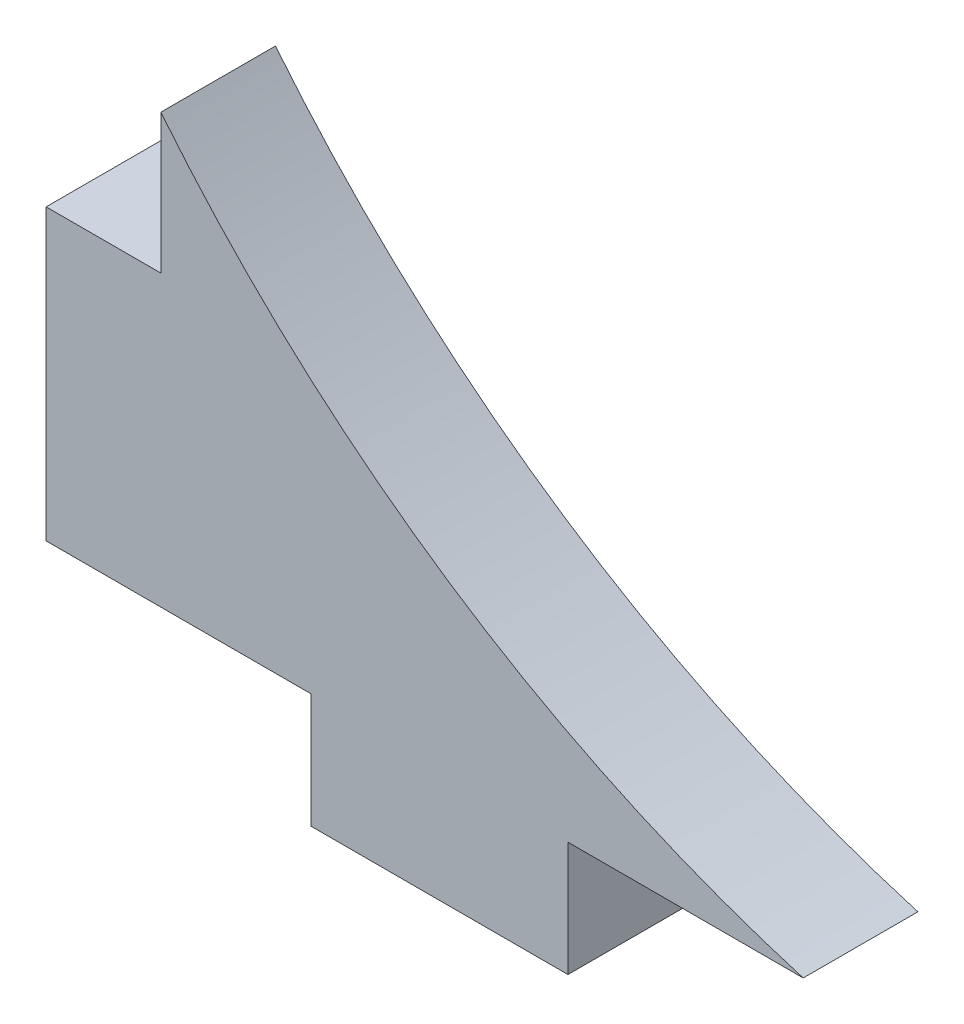
ISO-10303-21;
HEADER;
FILE_DESCRIPTION(('STEP AP214'),'2;1');
FILE_NAME('part.step','',(''),(''),'','','');
FILE_SCHEMA(('AUTOMOTIVE_DESIGN { 1 0 10303 214 1 1 1 1 }'));
ENDSEC;
DATA;
#1=APPLICATION_CONTEXT('core data for automotive mechanical design processes');
#2=APPLICATION_PROTOCOL_DEFINITION('international standard','automotive_design',2000,#1);
#3=PRODUCT_CONTEXT('',#1,'mechanical');
#4=PRODUCT('Part','Part','',(#3));
#5=PRODUCT_RELATED_PRODUCT_CATEGORY('part','',(#4));
#6=PRODUCT_DEFINITION_FORMATION('','',#4);
#7=PRODUCT_DEFINITION_CONTEXT('part definition',#1,'design');
#8=PRODUCT_DEFINITION('design','',#6,#7);
#9=PRODUCT_DEFINITION_SHAPE('','',#8);
#10=(LENGTH_UNIT() NAMED_UNIT(*) SI_UNIT(.MILLI.,.METRE.));
#11=(NAMED_UNIT(*) PLANE_ANGLE_UNIT() SI_UNIT($,.RADIAN.));
#12=(NAMED_UNIT(*) SI_UNIT($,.STERADIAN.) SOLID_ANGLE_UNIT());
#13=UNCERTAINTY_MEASURE_WITH_UNIT(LENGTH_MEASURE(1.E-05),#10,'distance_accuracy_value','');
#14=(GEOMETRIC_REPRESENTATION_CONTEXT(3) GLOBAL_UNCERTAINTY_ASSIGNED_CONTEXT((#13)) GLOBAL_UNIT_ASSIGNED_CONTEXT((#10,
#11,#12)) REPRESENTATION_CONTEXT('',''));
#15=CARTESIAN_POINT('',(0.,0.,0.));
#16=DIRECTION('',(0.,0.,1.));
#17=DIRECTION('',(1.,0.,0.));
#18=AXIS2_PLACEMENT_3D('',#15,#16,#17);
#19=CARTESIAN_POINT('',(52.4119370480957,63.4241694361046,5.35));
#20=DIRECTION('',(0.,0.,-1.));
#21=DIRECTION('',(-1.,0.,0.));
#22=AXIS2_PLACEMENT_3D('',#19,#20,#21);
#23=CYLINDRICAL_SURFACE('',#22,60.5348517727187);
#24=CARTESIAN_POINT('',(52.4119370480957,63.4241694361046,0.));
#25=DIRECTION('',(0.,0.,-1.));
#26=DIRECTION('',(1.,0.,0.));
#27=AXIS2_PLACEMENT_3D('',#24,#25,#26);
#28=CIRCLE('',#27,60.5348517727187);
#29=CARTESIAN_POINT('',(35.3280517737975,5.35000010860032,0.));
#30=VERTEX_POINT('',#29);
#31=CARTESIAN_POINT('',(5.34999999219954,25.3500002436995,0.));
#32=VERTEX_POINT('',#31);
#33=EDGE_CURVE('E135',#30,#32,#28,.T.);
#34=ORIENTED_EDGE('',*,*,#33,.T.);
#35=DIRECTION('',(0.,0.,-1.));
#36=VECTOR('',#35,1.);
#37=CARTESIAN_POINT('',(5.34999999219954,25.3500002436995,5.35));
#38=LINE('',#37,#36);
#39=CARTESIAN_POINT('',(5.34999999219954,25.3500002436995,5.35));
#40=VERTEX_POINT('',#39);
#41=EDGE_CURVE('E11',#40,#32,#38,.T.);
#42=ORIENTED_EDGE('',*,*,#41,.F.);
#43=CARTESIAN_POINT('',(52.4119370480957,63.4241694361046,5.35));
#44=DIRECTION('',(0.,0.,-1.));
#45=DIRECTION('',(1.,0.,0.));
#46=AXIS2_PLACEMENT_3D('',#43,#44,#45);
#47=CIRCLE('',#46,60.5348517727187);
#48=CARTESIAN_POINT('',(35.3280517737975,5.35000010860032,5.35));
#49=VERTEX_POINT('',#48);
#50=EDGE_CURVE('E151',#49,#40,#47,.T.);
#51=ORIENTED_EDGE('',*,*,#50,.F.);
#52=DIRECTION('',(0.,0.,-1.));
#53=VECTOR('',#52,1.);
#54=CARTESIAN_POINT('',(35.3280517737975,5.35000010860032,5.35));
#55=LINE('',#54,#53);
#56=EDGE_CURVE('E131',#49,#30,#55,.T.);
#57=ORIENTED_EDGE('',*,*,#56,.T.);
#58=EDGE_LOOP('',(#34,#42,#51,#57));
#59=FACE_BOUND('',#58,.T.);
#60=ADVANCED_FACE('F33',(#59),#23,.F.);
#61=CARTESIAN_POINT('',(5.34999999219954,18.8500001094994,5.35));
#62=DIRECTION('',(1.,0.,0.));
#63=DIRECTION('',(0.,0.,-1.));
#64=AXIS2_PLACEMENT_3D('',#61,#62,#63);
#65=PLANE('',#64);
#66=DIRECTION('',(0.,-1.,0.));
#67=VECTOR('',#66,1.);
#68=CARTESIAN_POINT('',(5.34999999219954,18.8500001094994,0.));
#69=LINE('',#68,#67);
#70=CARTESIAN_POINT('',(5.34999999219954,18.8500001094994,0.));
#71=VERTEX_POINT('',#70);
#72=EDGE_CURVE('E138',#32,#71,#69,.T.);
#73=ORIENTED_EDGE('',*,*,#72,.T.);
#74=DIRECTION('',(0.,0.,-1.));
#75=VECTOR('',#74,1.);
#76=CARTESIAN_POINT('',(5.34999999219954,18.8500001094994,5.35));
#77=LINE('',#76,#75);
#78=CARTESIAN_POINT('',(5.34999999219954,18.8500001094994,5.35));
#79=VERTEX_POINT('',#78);
#80=EDGE_CURVE('E41',#79,#71,#77,.T.);
#81=ORIENTED_EDGE('',*,*,#80,.F.);
#82=DIRECTION('',(0.,-1.,0.));
#83=VECTOR('',#82,1.);
#84=CARTESIAN_POINT('',(5.34999999219954,18.8500001094994,5.35));
#85=LINE('',#84,#83);
#86=EDGE_CURVE('E95',#40,#79,#85,.T.);
#87=ORIENTED_EDGE('',*,*,#86,.F.);
#88=ORIENTED_EDGE('',*,*,#41,.T.);
#89=EDGE_LOOP('',(#73,#81,#87,#88));
#90=FACE_BOUND('',#89,.T.);
#91=ADVANCED_FACE('F194',(#90),#65,.F.);
#92=CARTESIAN_POINT('',(0.,18.8500001094994,5.35));
#93=DIRECTION('',(0.,-1.,0.));
#94=DIRECTION('',(0.,0.,-1.));
#95=AXIS2_PLACEMENT_3D('',#92,#93,#94);
#96=PLANE('',#95);
#97=DIRECTION('',(-1.,0.,0.));
#98=VECTOR('',#97,1.);
#99=CARTESIAN_POINT('',(0.,18.8500001094994,0.));
#100=LINE('',#99,#98);
#101=CARTESIAN_POINT('',(0.,18.8500001094994,0.));
#102=VERTEX_POINT('',#101);
#103=EDGE_CURVE('E140',#71,#102,#100,.T.);
#104=ORIENTED_EDGE('',*,*,#103,.T.);
#105=DIRECTION('',(0.,0.,-1.));
#106=VECTOR('',#105,1.);
#107=CARTESIAN_POINT('',(0.,18.8500001094994,5.35));
#108=LINE('',#107,#106);
#109=CARTESIAN_POINT('',(0.,18.8500001094994,5.35));
#110=VERTEX_POINT('',#109);
#111=EDGE_CURVE('E161',#110,#102,#108,.T.);
#112=ORIENTED_EDGE('',*,*,#111,.F.);
#113=DIRECTION('',(-1.,0.,0.));
#114=VECTOR('',#113,1.);
#115=CARTESIAN_POINT('',(0.,18.8500001094994,5.35));
#116=LINE('',#115,#114);
#117=EDGE_CURVE('E169',#79,#110,#116,.T.);
#118=ORIENTED_EDGE('',*,*,#117,.F.);
#119=ORIENTED_EDGE('',*,*,#80,.T.);
#120=EDGE_LOOP('',(#104,#112,#118,#119));
#121=FACE_BOUND('',#120,.T.);
#122=ADVANCED_FACE('F167',(#121),#96,.F.);
#123=CARTESIAN_POINT('',(0.,5.35000010859937,5.35));
#124=DIRECTION('',(1.,0.,0.));
#125=DIRECTION('',(0.,0.,-1.));
#126=AXIS2_PLACEMENT_3D('',#123,#124,#125);
#127=PLANE('',#126);
#128=DIRECTION('',(0.,-1.,0.));
#129=VECTOR('',#128,1.);
#130=CARTESIAN_POINT('',(0.,5.35000010859937,0.));
#131=LINE('',#130,#129);
#132=CARTESIAN_POINT('',(0.,5.35000010859937,0.));
#133=VERTEX_POINT('',#132);
#134=EDGE_CURVE('E142',#102,#133,#131,.T.);
#135=ORIENTED_EDGE('',*,*,#134,.T.);
#136=DIRECTION('',(0.,0.,-1.));
#137=VECTOR('',#136,1.);
#138=CARTESIAN_POINT('',(0.,5.35000010859937,5.35));
#139=LINE('',#138,#137);
#140=CARTESIAN_POINT('',(0.,5.35000010859937,5.35));
#141=VERTEX_POINT('',#140);
#142=EDGE_CURVE('E158',#141,#133,#139,.T.);
#143=ORIENTED_EDGE('',*,*,#142,.F.);
#144=DIRECTION('',(0.,-1.,0.));
#145=VECTOR('',#144,1.);
#146=CARTESIAN_POINT('',(0.,5.35000010859937,5.35));
#147=LINE('',#146,#145);
#148=EDGE_CURVE('E185',#110,#141,#147,.T.);
#149=ORIENTED_EDGE('',*,*,#148,.F.);
#150=ORIENTED_EDGE('',*,*,#111,.T.);
#151=EDGE_LOOP('',(#135,#143,#149,#150));
#152=FACE_BOUND('',#151,.T.);
#153=ADVANCED_FACE('F178',(#152),#127,.F.);
#154=CARTESIAN_POINT('',(12.3500002082998,5.35000010859937,5.35));
#155=DIRECTION('',(0.,1.,0.));
#156=DIRECTION('',(0.,0.,1.));
#157=AXIS2_PLACEMENT_3D('',#154,#155,#156);
#158=PLANE('',#157);
#159=DIRECTION('',(1.,0.,0.));
#160=VECTOR('',#159,1.);
#161=CARTESIAN_POINT('',(12.3500002082998,5.35000010859937,0.));
#162=LINE('',#161,#160);
#163=CARTESIAN_POINT('',(12.3500002082998,5.35000010859937,0.));
#164=VERTEX_POINT('',#163);
#165=EDGE_CURVE('E144',#133,#164,#162,.T.);
#166=ORIENTED_EDGE('',*,*,#165,.T.);
#167=DIRECTION('',(0.,0.,-1.));
#168=VECTOR('',#167,1.);
#169=CARTESIAN_POINT('',(12.3500002082998,5.35000010859937,5.35));
#170=LINE('',#169,#168);
#171=CARTESIAN_POINT('',(12.3500002082998,5.35000010859937,5.35));
#172=VERTEX_POINT('',#171);
#173=EDGE_CURVE('E155',#172,#164,#170,.T.);
#174=ORIENTED_EDGE('',*,*,#173,.F.);
#175=DIRECTION('',(1.,0.,0.));
#176=VECTOR('',#175,1.);
#177=CARTESIAN_POINT('',(12.3500002082998,5.35000010859937,5.35));
#178=LINE('',#177,#176);
#179=EDGE_CURVE('E184',#141,#172,#178,.T.);
#180=ORIENTED_EDGE('',*,*,#179,.F.);
#181=ORIENTED_EDGE('',*,*,#142,.T.);
#182=EDGE_LOOP('',(#166,#174,#180,#181));
#183=FACE_BOUND('',#182,.T.);
#184=ADVANCED_FACE('F182',(#183),#158,.F.);
#185=CARTESIAN_POINT('',(12.3500002082998,1.11022302462516E-13,5.35));
#186=DIRECTION('',(1.,0.,0.));
#187=DIRECTION('',(0.,0.,-1.));
#188=AXIS2_PLACEMENT_3D('',#185,#186,#187);
#189=PLANE('',#188);
#190=DIRECTION('',(0.,-1.,0.));
#191=VECTOR('',#190,1.);
#192=CARTESIAN_POINT('',(12.3500002082998,1.11022302462516E-13,0.));
#193=LINE('',#192,#191);
#194=CARTESIAN_POINT('',(12.3500002082998,1.11022302462516E-13,0.));
#195=VERTEX_POINT('',#194);
#196=EDGE_CURVE('E146',#164,#195,#193,.T.);
#197=ORIENTED_EDGE('',*,*,#196,.T.);
#198=DIRECTION('',(0.,0.,-1.));
#199=VECTOR('',#198,1.);
#200=CARTESIAN_POINT('',(12.3500002082998,1.11022302462516E-13,5.35));
#201=LINE('',#200,#199);
#202=CARTESIAN_POINT('',(12.3500002082998,1.11022302462516E-13,5.35));
#203=VERTEX_POINT('',#202);
#204=EDGE_CURVE('E126',#203,#195,#201,.T.);
#205=ORIENTED_EDGE('',*,*,#204,.F.);
#206=DIRECTION('',(0.,-1.,0.));
#207=VECTOR('',#206,1.);
#208=CARTESIAN_POINT('',(12.3500002082998,1.11022302462516E-13,5.35));
#209=LINE('',#208,#207);
#210=EDGE_CURVE('E117',#172,#203,#209,.T.);
#211=ORIENTED_EDGE('',*,*,#210,.F.);
#212=ORIENTED_EDGE('',*,*,#173,.T.);
#213=EDGE_LOOP('',(#197,#205,#211,#212));
#214=FACE_BOUND('',#213,.T.);
#215=ADVANCED_FACE('F206',(#214),#189,.F.);
#216=CARTESIAN_POINT('',(24.3499993812,1.11022302462516E-13,5.35));
#217=DIRECTION('',(0.,1.,0.));
#218=DIRECTION('',(0.,0.,1.));
#219=AXIS2_PLACEMENT_3D('',#216,#217,#218);
#220=PLANE('',#219);
#221=DIRECTION('',(1.,0.,0.));
#222=VECTOR('',#221,1.);
#223=CARTESIAN_POINT('',(24.3499993812,1.11022302462516E-13,0.));
#224=LINE('',#223,#222);
#225=CARTESIAN_POINT('',(24.3499993812,1.11022302462516E-13,0.));
#226=VERTEX_POINT('',#225);
#227=EDGE_CURVE('E125',#195,#226,#224,.T.);
#228=ORIENTED_EDGE('',*,*,#227,.T.);
#229=DIRECTION('',(0.,0.,-1.));
#230=VECTOR('',#229,1.);
#231=CARTESIAN_POINT('',(24.3499993812,1.11022302462516E-13,5.35));
#232=LINE('',#231,#230);
#233=CARTESIAN_POINT('',(24.3499993812,1.11022302462516E-13,5.35));
#234=VERTEX_POINT('',#233);
#235=EDGE_CURVE('E122',#234,#226,#232,.T.);
#236=ORIENTED_EDGE('',*,*,#235,.F.);
#237=DIRECTION('',(1.,0.,0.));
#238=VECTOR('',#237,1.);
#239=CARTESIAN_POINT('',(24.3499993812,1.11022302462516E-13,5.35));
#240=LINE('',#239,#238);
#241=EDGE_CURVE('E111',#203,#234,#240,.T.);
#242=ORIENTED_EDGE('',*,*,#241,.F.);
#243=ORIENTED_EDGE('',*,*,#204,.T.);
#244=EDGE_LOOP('',(#228,#236,#242,#243));
#245=FACE_BOUND('',#244,.T.);
#246=ADVANCED_FACE('F123',(#245),#220,.F.);
#247=CARTESIAN_POINT('',(24.3499993812,5.35000010860032,5.35));
#248=DIRECTION('',(-1.,0.,0.));
#249=DIRECTION('',(0.,0.,1.));
#250=AXIS2_PLACEMENT_3D('',#247,#248,#249);
#251=PLANE('',#250);
#252=DIRECTION('',(0.,1.,0.));
#253=VECTOR('',#252,1.);
#254=CARTESIAN_POINT('',(24.3499993812,5.35000010860032,0.));
#255=LINE('',#254,#253);
#256=CARTESIAN_POINT('',(24.3499993812,5.35000010860032,0.));
#257=VERTEX_POINT('',#256);
#258=EDGE_CURVE('E81',#226,#257,#255,.T.);
#259=ORIENTED_EDGE('',*,*,#258,.T.);
#260=DIRECTION('',(0.,0.,-1.));
#261=VECTOR('',#260,1.);
#262=CARTESIAN_POINT('',(24.3499993812,5.35000010860032,5.35));
#263=LINE('',#262,#261);
#264=CARTESIAN_POINT('',(24.3499993812,5.35000010860032,5.35));
#265=VERTEX_POINT('',#264);
#266=EDGE_CURVE('E127',#265,#257,#263,.T.);
#267=ORIENTED_EDGE('',*,*,#266,.F.);
#268=DIRECTION('',(0.,1.,0.));
#269=VECTOR('',#268,1.);
#270=CARTESIAN_POINT('',(24.3499993812,5.35000010860032,5.35));
#271=LINE('',#270,#269);
#272=EDGE_CURVE('E115',#234,#265,#271,.T.);
#273=ORIENTED_EDGE('',*,*,#272,.F.);
#274=ORIENTED_EDGE('',*,*,#235,.T.);
#275=EDGE_LOOP('',(#259,#267,#273,#274));
#276=FACE_BOUND('',#275,.T.);
#277=ADVANCED_FACE('F129',(#276),#251,.F.);
#278=CARTESIAN_POINT('',(35.3280517737975,5.35000010860032,5.35));
#279=DIRECTION('',(0.,1.,0.));
#280=DIRECTION('',(0.,0.,1.));
#281=AXIS2_PLACEMENT_3D('',#278,#279,#280);
#282=PLANE('',#281);
#283=DIRECTION('',(1.,0.,0.));
#284=VECTOR('',#283,1.);
#285=CARTESIAN_POINT('',(35.3280517737975,5.35000010860032,0.));
#286=LINE('',#285,#284);
#287=EDGE_CURVE('E87',#257,#30,#286,.T.);
#288=ORIENTED_EDGE('',*,*,#287,.T.);
#289=ORIENTED_EDGE('',*,*,#56,.F.);
#290=DIRECTION('',(1.,0.,0.));
#291=VECTOR('',#290,1.);
#292=CARTESIAN_POINT('',(35.3280517737975,5.35000010860032,5.35));
#293=LINE('',#292,#291);
#294=EDGE_CURVE('E49',#265,#49,#293,.T.);
#295=ORIENTED_EDGE('',*,*,#294,.F.);
#296=ORIENTED_EDGE('',*,*,#266,.T.);
#297=EDGE_LOOP('',(#288,#289,#295,#296));
#298=FACE_BOUND('',#297,.T.);
#299=ADVANCED_FACE('F214',(#298),#282,.F.);
#300=CARTESIAN_POINT('',(52.4119370480957,63.4241694361046,5.35));
#301=DIRECTION('',(0.,0.,1.));
#302=DIRECTION('',(1.,0.,0.));
#303=AXIS2_PLACEMENT_3D('',#300,#301,#302);
#304=PLANE('',#303);
#305=ORIENTED_EDGE('',*,*,#50,.T.);
#306=ORIENTED_EDGE('',*,*,#86,.T.);
#307=ORIENTED_EDGE('',*,*,#117,.T.);
#308=ORIENTED_EDGE('',*,*,#148,.T.);
#309=ORIENTED_EDGE('',*,*,#179,.T.);
#310=ORIENTED_EDGE('',*,*,#210,.T.);
#311=ORIENTED_EDGE('',*,*,#241,.T.);
#312=ORIENTED_EDGE('',*,*,#272,.T.);
#313=ORIENTED_EDGE('',*,*,#294,.T.);
#314=EDGE_LOOP('',(#305,#306,#307,#308,#309,#310,#311,#312,#313));
#315=FACE_BOUND('',#314,.T.);
#316=ADVANCED_FACE('F113',(#315),#304,.T.);
#317=CARTESIAN_POINT('',(52.4119370480957,63.4241694361046,0.));
#318=DIRECTION('',(0.,0.,1.));
#319=DIRECTION('',(1.,0.,0.));
#320=AXIS2_PLACEMENT_3D('',#317,#318,#319);
#321=PLANE('',#320);
#322=ORIENTED_EDGE('',*,*,#33,.F.);
#323=ORIENTED_EDGE('',*,*,#287,.F.);
#324=ORIENTED_EDGE('',*,*,#258,.F.);
#325=ORIENTED_EDGE('',*,*,#227,.F.);
#326=ORIENTED_EDGE('',*,*,#196,.F.);
#327=ORIENTED_EDGE('',*,*,#165,.F.);
#328=ORIENTED_EDGE('',*,*,#134,.F.);
#329=ORIENTED_EDGE('',*,*,#103,.F.);
#330=ORIENTED_EDGE('',*,*,#72,.F.);
#331=EDGE_LOOP('',(#322,#323,#324,#325,#326,#327,#328,#329,#330));
#332=FACE_BOUND('',#331,.T.);
#333=ADVANCED_FACE('F173',(#332),#321,.F.);
#334=CLOSED_SHELL('',(#60,#91,#122,#153,#184,#215,#246,#277,#299,#316,#333));
#335=MANIFOLD_SOLID_BREP('B2',#334);
#336=ADVANCED_BREP_SHAPE_REPRESENTATION('',(#18,#335),#14);
#337=SHAPE_DEFINITION_REPRESENTATION(#9,#336);
ENDSEC;
END-ISO-10303-21;
